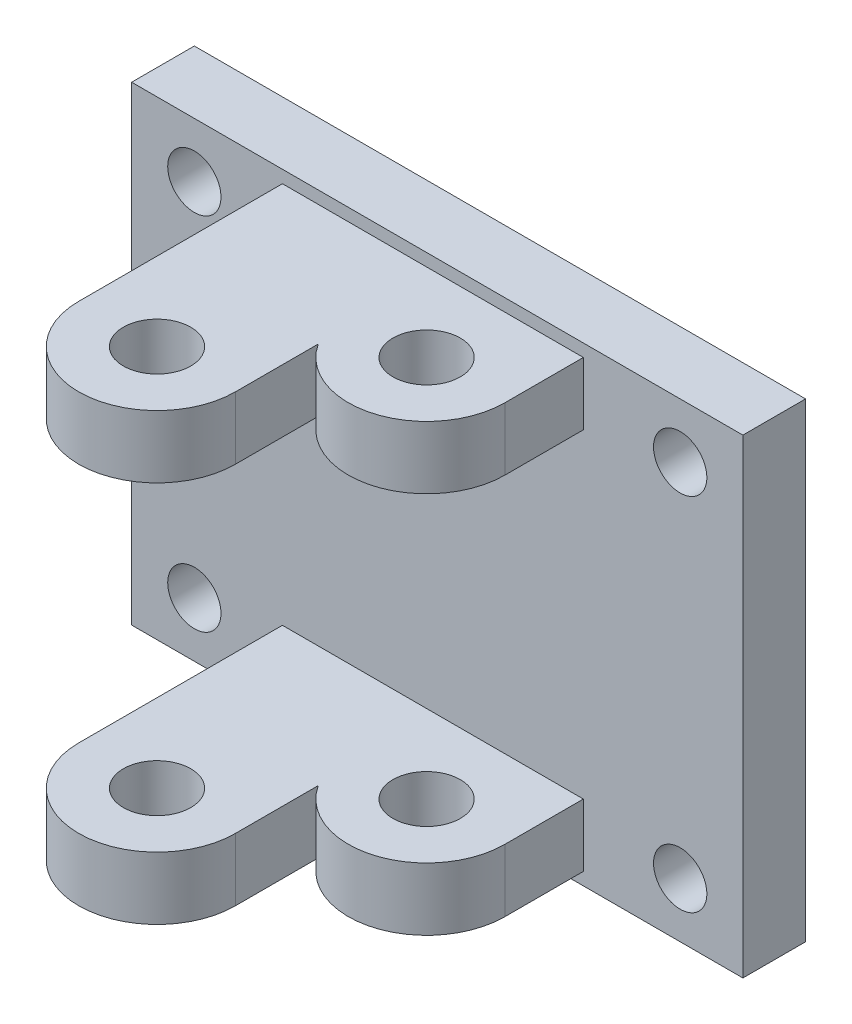
ISO-10303-21;
HEADER;
FILE_DESCRIPTION(('STEP AP214'),'2;1');
FILE_NAME('part.step','',(''),(''),'','','');
FILE_SCHEMA(('AUTOMOTIVE_DESIGN { 1 0 10303 214 1 1 1 1 }'));
ENDSEC;
DATA;
#1=APPLICATION_CONTEXT('core data for automotive mechanical design processes');
#2=APPLICATION_PROTOCOL_DEFINITION('international standard','automotive_design',2000,#1);
#3=PRODUCT_CONTEXT('',#1,'mechanical');
#4=PRODUCT('Part','Part','',(#3));
#5=PRODUCT_RELATED_PRODUCT_CATEGORY('part','',(#4));
#6=PRODUCT_DEFINITION_FORMATION('','',#4);
#7=PRODUCT_DEFINITION_CONTEXT('part definition',#1,'design');
#8=PRODUCT_DEFINITION('design','',#6,#7);
#9=PRODUCT_DEFINITION_SHAPE('','',#8);
#10=(LENGTH_UNIT() NAMED_UNIT(*) SI_UNIT(.MILLI.,.METRE.));
#11=(NAMED_UNIT(*) PLANE_ANGLE_UNIT() SI_UNIT($,.RADIAN.));
#12=(NAMED_UNIT(*) SI_UNIT($,.STERADIAN.) SOLID_ANGLE_UNIT());
#13=UNCERTAINTY_MEASURE_WITH_UNIT(LENGTH_MEASURE(1.E-05),#10,'distance_accuracy_value','');
#14=(GEOMETRIC_REPRESENTATION_CONTEXT(3) GLOBAL_UNCERTAINTY_ASSIGNED_CONTEXT((#13)) GLOBAL_UNIT_ASSIGNED_CONTEXT((#10,
#11,#12)) REPRESENTATION_CONTEXT('',''));
#15=CARTESIAN_POINT('',(0.,0.,0.));
#16=DIRECTION('',(0.,0.,1.));
#17=DIRECTION('',(1.,0.,0.));
#18=AXIS2_PLACEMENT_3D('',#15,#16,#17);
#19=CARTESIAN_POINT('',(42.620525892443,-10.2,21.));
#20=DIRECTION('',(-1.,0.,0.));
#21=DIRECTION('',(0.,0.,1.));
#22=AXIS2_PLACEMENT_3D('',#19,#20,#21);
#23=PLANE('',#22);
#24=DIRECTION('',(0.,-1.,0.));
#25=VECTOR('',#24,1.);
#26=CARTESIAN_POINT('',(42.620525892443,-10.2,15.7129319932486));
#27=LINE('',#26,#25);
#28=CARTESIAN_POINT('',(42.620525892443,-10.2,15.7129319932486));
#29=VERTEX_POINT('',#28);
#30=CARTESIAN_POINT('',(42.620525892443,-14.2,15.7129319932486));
#31=VERTEX_POINT('',#30);
#32=EDGE_CURVE('E161',#29,#31,#27,.T.);
#33=ORIENTED_EDGE('',*,*,#32,.F.);
#34=DIRECTION('',(0.,0.,-1.));
#35=VECTOR('',#34,1.);
#36=CARTESIAN_POINT('',(42.620525892443,-10.2,21.));
#37=LINE('',#36,#35);
#38=CARTESIAN_POINT('',(42.620525892443,-10.2,21.));
#39=VERTEX_POINT('',#38);
#40=EDGE_CURVE('E391',#39,#29,#37,.T.);
#41=ORIENTED_EDGE('',*,*,#40,.F.);
#42=DIRECTION('',(0.,-1.,0.));
#43=VECTOR('',#42,1.);
#44=CARTESIAN_POINT('',(42.620525892443,-10.2,21.));
#45=LINE('',#44,#43);
#46=CARTESIAN_POINT('',(42.620525892443,-14.2,21.));
#47=VERTEX_POINT('',#46);
#48=EDGE_CURVE('E184',#39,#47,#45,.T.);
#49=ORIENTED_EDGE('',*,*,#48,.T.);
#50=DIRECTION('',(0.,0.,-1.));
#51=VECTOR('',#50,1.);
#52=CARTESIAN_POINT('',(42.620525892443,-14.2,21.));
#53=LINE('',#52,#51);
#54=EDGE_CURVE('E180',#47,#31,#53,.T.);
#55=ORIENTED_EDGE('',*,*,#54,.T.);
#56=EDGE_LOOP('',(#33,#41,#49,#55));
#57=FACE_BOUND('',#56,.T.);
#58=ADVANCED_FACE('F44',(#57),#23,.F.);
#59=CARTESIAN_POINT('',(0.,0.,8.));
#60=DIRECTION('',(0.,0.,-1.));
#61=DIRECTION('',(-1.,0.,0.));
#62=AXIS2_PLACEMENT_3D('',#59,#60,#61);
#63=PLANE('',#62);
#64=CARTESIAN_POINT('',(27.,11.5,8.));
#65=DIRECTION('',(0.,0.,-1.));
#66=DIRECTION('',(-1.,0.,0.));
#67=AXIS2_PLACEMENT_3D('',#64,#65,#66);
#68=CIRCLE('',#67,1.7);
#69=CARTESIAN_POINT('',(25.3,11.5,8.));
#70=VERTEX_POINT('',#69);
#71=EDGE_CURVE('E314',#70,#70,#68,.F.);
#72=ORIENTED_EDGE('',*,*,#71,.F.);
#73=EDGE_LOOP('',(#72));
#74=FACE_BOUND('',#73,.T.);
#75=CARTESIAN_POINT('',(58.,-11.5,8.));
#76=DIRECTION('',(0.,0.,-1.));
#77=DIRECTION('',(-1.,0.,0.));
#78=AXIS2_PLACEMENT_3D('',#75,#76,#77);
#79=CIRCLE('',#78,1.7);
#80=CARTESIAN_POINT('',(56.3,-11.5,8.));
#81=VERTEX_POINT('',#80);
#82=EDGE_CURVE('E334',#81,#81,#79,.F.);
#83=ORIENTED_EDGE('',*,*,#82,.F.);
#84=EDGE_LOOP('',(#83));
#85=FACE_BOUND('',#84,.T.);
#86=CARTESIAN_POINT('',(58.,11.5,8.));
#87=DIRECTION('',(0.,0.,-1.));
#88=DIRECTION('',(-1.,0.,0.));
#89=AXIS2_PLACEMENT_3D('',#86,#87,#88);
#90=CIRCLE('',#89,1.7);
#91=CARTESIAN_POINT('',(56.3,11.5,8.));
#92=VERTEX_POINT('',#91);
#93=EDGE_CURVE('E328',#92,#92,#90,.F.);
#94=ORIENTED_EDGE('',*,*,#93,.F.);
#95=EDGE_LOOP('',(#94));
#96=FACE_BOUND('',#95,.T.);
#97=CARTESIAN_POINT('',(27.,-11.5,8.));
#98=DIRECTION('',(0.,0.,-1.));
#99=DIRECTION('',(-1.,0.,0.));
#100=AXIS2_PLACEMENT_3D('',#97,#98,#99);
#101=CIRCLE('',#100,1.7);
#102=CARTESIAN_POINT('',(25.3,-11.5,8.));
#103=VERTEX_POINT('',#102);
#104=EDGE_CURVE('E324',#103,#103,#101,.F.);
#105=ORIENTED_EDGE('',*,*,#104,.F.);
#106=EDGE_LOOP('',(#105));
#107=FACE_BOUND('',#106,.T.);
#108=DIRECTION('',(0.,-1.,0.));
#109=VECTOR('',#108,1.);
#110=CARTESIAN_POINT('',(51.820525892444,-10.2,8.));
#111=LINE('',#110,#109);
#112=CARTESIAN_POINT('',(51.820525892444,-10.2,8.));
#113=VERTEX_POINT('',#112);
#114=CARTESIAN_POINT('',(51.820525892444,-14.2,8.));
#115=VERTEX_POINT('',#114);
#116=EDGE_CURVE('E372',#113,#115,#111,.T.);
#117=ORIENTED_EDGE('',*,*,#116,.T.);
#118=DIRECTION('',(-1.,0.,0.));
#119=VECTOR('',#118,1.);
#120=CARTESIAN_POINT('',(32.620525892443,-14.2,8.));
#121=LINE('',#120,#119);
#122=CARTESIAN_POINT('',(32.620525892443,-14.2,8.));
#123=VERTEX_POINT('',#122);
#124=EDGE_CURVE('E72',#115,#123,#121,.T.);
#125=ORIENTED_EDGE('',*,*,#124,.T.);
#126=DIRECTION('',(0.,-1.,0.));
#127=VECTOR('',#126,1.);
#128=CARTESIAN_POINT('',(32.620525892443,-10.2,8.));
#129=LINE('',#128,#127);
#130=CARTESIAN_POINT('',(32.620525892443,-10.2,8.));
#131=VERTEX_POINT('',#130);
#132=EDGE_CURVE('E197',#131,#123,#129,.T.);
#133=ORIENTED_EDGE('',*,*,#132,.F.);
#134=DIRECTION('',(-1.,0.,0.));
#135=VECTOR('',#134,1.);
#136=CARTESIAN_POINT('',(32.620525892443,-10.2,8.));
#137=LINE('',#136,#135);
#138=EDGE_CURVE('E62',#113,#131,#137,.T.);
#139=ORIENTED_EDGE('',*,*,#138,.F.);
#140=EDGE_LOOP('',(#117,#125,#133,#139));
#141=FACE_BOUND('',#140,.T.);
#142=DIRECTION('',(0.,-1.,0.));
#143=VECTOR('',#142,1.);
#144=CARTESIAN_POINT('',(23.,-15.,8.));
#145=LINE('',#144,#143);
#146=CARTESIAN_POINT('',(23.,15.,8.));
#147=VERTEX_POINT('',#146);
#148=CARTESIAN_POINT('',(23.,-15.,8.));
#149=VERTEX_POINT('',#148);
#150=EDGE_CURVE('E272',#147,#149,#145,.T.);
#151=ORIENTED_EDGE('',*,*,#150,.T.);
#152=DIRECTION('',(1.,0.,0.));
#153=VECTOR('',#152,1.);
#154=CARTESIAN_POINT('',(23.,-15.,8.));
#155=LINE('',#154,#153);
#156=CARTESIAN_POINT('',(62.,-15.,8.));
#157=VERTEX_POINT('',#156);
#158=EDGE_CURVE('E280',#149,#157,#155,.T.);
#159=ORIENTED_EDGE('',*,*,#158,.T.);
#160=DIRECTION('',(0.,1.,0.));
#161=VECTOR('',#160,1.);
#162=CARTESIAN_POINT('',(62.,-15.,8.));
#163=LINE('',#162,#161);
#164=CARTESIAN_POINT('',(62.,15.,8.));
#165=VERTEX_POINT('',#164);
#166=EDGE_CURVE('E281',#157,#165,#163,.T.);
#167=ORIENTED_EDGE('',*,*,#166,.T.);
#168=DIRECTION('',(-1.,0.,0.));
#169=VECTOR('',#168,1.);
#170=CARTESIAN_POINT('',(23.,15.,8.));
#171=LINE('',#170,#169);
#172=EDGE_CURVE('E283',#165,#147,#171,.T.);
#173=ORIENTED_EDGE('',*,*,#172,.T.);
#174=EDGE_LOOP('',(#151,#159,#167,#173));
#175=FACE_BOUND('',#174,.T.);
#176=DIRECTION('',(0.,-1.,0.));
#177=VECTOR('',#176,1.);
#178=CARTESIAN_POINT('',(51.820525892444,14.2,8.));
#179=LINE('',#178,#177);
#180=CARTESIAN_POINT('',(51.820525892444,14.2,8.));
#181=VERTEX_POINT('',#180);
#182=CARTESIAN_POINT('',(51.820525892444,10.2,8.));
#183=VERTEX_POINT('',#182);
#184=EDGE_CURVE('E222',#181,#183,#179,.T.);
#185=ORIENTED_EDGE('',*,*,#184,.T.);
#186=DIRECTION('',(-1.,0.,0.));
#187=VECTOR('',#186,1.);
#188=CARTESIAN_POINT('',(32.620525892443,10.2,8.));
#189=LINE('',#188,#187);
#190=CARTESIAN_POINT('',(32.620525892443,10.2,8.));
#191=VERTEX_POINT('',#190);
#192=EDGE_CURVE('E244',#183,#191,#189,.T.);
#193=ORIENTED_EDGE('',*,*,#192,.T.);
#194=DIRECTION('',(0.,-1.,0.));
#195=VECTOR('',#194,1.);
#196=CARTESIAN_POINT('',(32.620525892443,14.2,8.));
#197=LINE('',#196,#195);
#198=CARTESIAN_POINT('',(32.620525892443,14.2,8.));
#199=VERTEX_POINT('',#198);
#200=EDGE_CURVE('E252',#199,#191,#197,.T.);
#201=ORIENTED_EDGE('',*,*,#200,.F.);
#202=DIRECTION('',(-1.,0.,0.));
#203=VECTOR('',#202,1.);
#204=CARTESIAN_POINT('',(32.620525892443,14.2,8.));
#205=LINE('',#204,#203);
#206=EDGE_CURVE('E246',#181,#199,#205,.T.);
#207=ORIENTED_EDGE('',*,*,#206,.F.);
#208=EDGE_LOOP('',(#185,#193,#201,#207));
#209=FACE_BOUND('',#208,.T.);
#210=ADVANCED_FACE('F405',(#74,#85,#96,#107,#141,#175,#209),#63,.F.);
#211=CARTESIAN_POINT('',(42.620525892443,14.2,21.));
#212=DIRECTION('',(-1.,0.,0.));
#213=DIRECTION('',(0.,0.,1.));
#214=AXIS2_PLACEMENT_3D('',#211,#212,#213);
#215=PLANE('',#214);
#216=DIRECTION('',(0.,-1.,0.));
#217=VECTOR('',#216,1.);
#218=CARTESIAN_POINT('',(42.620525892443,14.2,15.7129319932486));
#219=LINE('',#218,#217);
#220=CARTESIAN_POINT('',(42.620525892443,14.2,15.7129319932486));
#221=VERTEX_POINT('',#220);
#222=CARTESIAN_POINT('',(42.620525892443,10.2,15.7129319932486));
#223=VERTEX_POINT('',#222);
#224=EDGE_CURVE('E211',#221,#223,#219,.T.);
#225=ORIENTED_EDGE('',*,*,#224,.F.);
#226=DIRECTION('',(0.,0.,-1.));
#227=VECTOR('',#226,1.);
#228=CARTESIAN_POINT('',(42.620525892443,14.2,21.));
#229=LINE('',#228,#227);
#230=CARTESIAN_POINT('',(42.620525892443,14.2,21.));
#231=VERTEX_POINT('',#230);
#232=EDGE_CURVE('E243',#231,#221,#229,.T.);
#233=ORIENTED_EDGE('',*,*,#232,.F.);
#234=DIRECTION('',(0.,-1.,0.));
#235=VECTOR('',#234,1.);
#236=CARTESIAN_POINT('',(42.620525892443,14.2,21.));
#237=LINE('',#236,#235);
#238=CARTESIAN_POINT('',(42.620525892443,10.2,21.));
#239=VERTEX_POINT('',#238);
#240=EDGE_CURVE('E264',#231,#239,#237,.T.);
#241=ORIENTED_EDGE('',*,*,#240,.T.);
#242=DIRECTION('',(0.,0.,-1.));
#243=VECTOR('',#242,1.);
#244=CARTESIAN_POINT('',(42.620525892443,10.2,21.));
#245=LINE('',#244,#243);
#246=EDGE_CURVE('E258',#239,#223,#245,.T.);
#247=ORIENTED_EDGE('',*,*,#246,.T.);
#248=EDGE_LOOP('',(#225,#233,#241,#247));
#249=FACE_BOUND('',#248,.T.);
#250=ADVANCED_FACE('F425',(#249),#215,.F.);
#251=CARTESIAN_POINT('',(23.,-15.,8.));
#252=DIRECTION('',(1.,0.,0.));
#253=DIRECTION('',(0.,0.,-1.));
#254=AXIS2_PLACEMENT_3D('',#251,#252,#253);
#255=PLANE('',#254);
#256=DIRECTION('',(0.,-1.,0.));
#257=VECTOR('',#256,1.);
#258=CARTESIAN_POINT('',(23.,-15.,4.));
#259=LINE('',#258,#257);
#260=CARTESIAN_POINT('',(23.,15.,4.));
#261=VERTEX_POINT('',#260);
#262=CARTESIAN_POINT('',(23.,-15.,4.));
#263=VERTEX_POINT('',#262);
#264=EDGE_CURVE('E275',#261,#263,#259,.T.);
#265=ORIENTED_EDGE('',*,*,#264,.T.);
#266=DIRECTION('',(0.,0.,-1.));
#267=VECTOR('',#266,1.);
#268=CARTESIAN_POINT('',(23.,-15.,8.));
#269=LINE('',#268,#267);
#270=EDGE_CURVE('E11',#149,#263,#269,.T.);
#271=ORIENTED_EDGE('',*,*,#270,.F.);
#272=ORIENTED_EDGE('',*,*,#150,.F.);
#273=DIRECTION('',(0.,0.,-1.));
#274=VECTOR('',#273,1.);
#275=CARTESIAN_POINT('',(23.,15.,8.));
#276=LINE('',#275,#274);
#277=EDGE_CURVE('E289',#147,#261,#276,.T.);
#278=ORIENTED_EDGE('',*,*,#277,.T.);
#279=EDGE_LOOP('',(#265,#271,#272,#278));
#280=FACE_BOUND('',#279,.T.);
#281=ADVANCED_FACE('F50',(#280),#255,.F.);
#282=CARTESIAN_POINT('',(23.,-15.,8.));
#283=DIRECTION('',(0.,1.,0.));
#284=DIRECTION('',(0.,0.,1.));
#285=AXIS2_PLACEMENT_3D('',#282,#283,#284);
#286=PLANE('',#285);
#287=DIRECTION('',(1.,0.,0.));
#288=VECTOR('',#287,1.);
#289=CARTESIAN_POINT('',(23.,-15.,4.));
#290=LINE('',#289,#288);
#291=CARTESIAN_POINT('',(62.,-15.,4.));
#292=VERTEX_POINT('',#291);
#293=EDGE_CURVE('E292',#263,#292,#290,.T.);
#294=ORIENTED_EDGE('',*,*,#293,.T.);
#295=DIRECTION('',(0.,0.,-1.));
#296=VECTOR('',#295,1.);
#297=CARTESIAN_POINT('',(62.,-15.,8.));
#298=LINE('',#297,#296);
#299=EDGE_CURVE('E54',#157,#292,#298,.T.);
#300=ORIENTED_EDGE('',*,*,#299,.F.);
#301=ORIENTED_EDGE('',*,*,#158,.F.);
#302=ORIENTED_EDGE('',*,*,#270,.T.);
#303=EDGE_LOOP('',(#294,#300,#301,#302));
#304=FACE_BOUND('',#303,.T.);
#305=ADVANCED_FACE('F469',(#304),#286,.F.);
#306=CARTESIAN_POINT('',(62.,-15.,8.));
#307=DIRECTION('',(-1.,0.,0.));
#308=DIRECTION('',(0.,0.,1.));
#309=AXIS2_PLACEMENT_3D('',#306,#307,#308);
#310=PLANE('',#309);
#311=DIRECTION('',(0.,1.,0.));
#312=VECTOR('',#311,1.);
#313=CARTESIAN_POINT('',(62.,-15.,4.));
#314=LINE('',#313,#312);
#315=CARTESIAN_POINT('',(62.,15.,4.));
#316=VERTEX_POINT('',#315);
#317=EDGE_CURVE('E294',#292,#316,#314,.T.);
#318=ORIENTED_EDGE('',*,*,#317,.T.);
#319=DIRECTION('',(0.,0.,-1.));
#320=VECTOR('',#319,1.);
#321=CARTESIAN_POINT('',(62.,15.,8.));
#322=LINE('',#321,#320);
#323=EDGE_CURVE('E304',#165,#316,#322,.T.);
#324=ORIENTED_EDGE('',*,*,#323,.F.);
#325=ORIENTED_EDGE('',*,*,#166,.F.);
#326=ORIENTED_EDGE('',*,*,#299,.T.);
#327=EDGE_LOOP('',(#318,#324,#325,#326));
#328=FACE_BOUND('',#327,.T.);
#329=ADVANCED_FACE('F463',(#328),#310,.F.);
#330=CARTESIAN_POINT('',(23.,15.,8.));
#331=DIRECTION('',(0.,-1.,0.));
#332=DIRECTION('',(0.,0.,-1.));
#333=AXIS2_PLACEMENT_3D('',#330,#331,#332);
#334=PLANE('',#333);
#335=DIRECTION('',(-1.,0.,0.));
#336=VECTOR('',#335,1.);
#337=CARTESIAN_POINT('',(23.,15.,4.));
#338=LINE('',#337,#336);
#339=EDGE_CURVE('E279',#316,#261,#338,.T.);
#340=ORIENTED_EDGE('',*,*,#339,.T.);
#341=ORIENTED_EDGE('',*,*,#277,.F.);
#342=ORIENTED_EDGE('',*,*,#172,.F.);
#343=ORIENTED_EDGE('',*,*,#323,.T.);
#344=EDGE_LOOP('',(#340,#341,#342,#343));
#345=FACE_BOUND('',#344,.T.);
#346=ADVANCED_FACE('F458',(#345),#334,.F.);
#347=CARTESIAN_POINT('',(0.,0.,4.));
#348=DIRECTION('',(0.,0.,-1.));
#349=DIRECTION('',(-1.,0.,0.));
#350=AXIS2_PLACEMENT_3D('',#347,#348,#349);
#351=PLANE('',#350);
#352=CARTESIAN_POINT('',(27.,11.5,4.));
#353=DIRECTION('',(0.,0.,-1.));
#354=DIRECTION('',(-1.,0.,0.));
#355=AXIS2_PLACEMENT_3D('',#352,#353,#354);
#356=CIRCLE('',#355,1.7);
#357=CARTESIAN_POINT('',(25.3,11.5,4.));
#358=VERTEX_POINT('',#357);
#359=EDGE_CURVE('E47',#358,#358,#356,.F.);
#360=ORIENTED_EDGE('',*,*,#359,.T.);
#361=EDGE_LOOP('',(#360));
#362=FACE_BOUND('',#361,.T.);
#363=CARTESIAN_POINT('',(58.,-11.5,4.));
#364=DIRECTION('',(0.,0.,-1.));
#365=DIRECTION('',(-1.,0.,0.));
#366=AXIS2_PLACEMENT_3D('',#363,#364,#365);
#367=CIRCLE('',#366,1.7);
#368=CARTESIAN_POINT('',(56.3,-11.5,4.));
#369=VERTEX_POINT('',#368);
#370=EDGE_CURVE('E329',#369,#369,#367,.F.);
#371=ORIENTED_EDGE('',*,*,#370,.T.);
#372=EDGE_LOOP('',(#371));
#373=FACE_BOUND('',#372,.T.);
#374=CARTESIAN_POINT('',(58.,11.5,4.));
#375=DIRECTION('',(0.,0.,-1.));
#376=DIRECTION('',(-1.,0.,0.));
#377=AXIS2_PLACEMENT_3D('',#374,#375,#376);
#378=CIRCLE('',#377,1.7);
#379=CARTESIAN_POINT('',(56.3,11.5,4.));
#380=VERTEX_POINT('',#379);
#381=EDGE_CURVE('E326',#380,#380,#378,.F.);
#382=ORIENTED_EDGE('',*,*,#381,.T.);
#383=EDGE_LOOP('',(#382));
#384=FACE_BOUND('',#383,.T.);
#385=CARTESIAN_POINT('',(27.,-11.5,4.));
#386=DIRECTION('',(0.,0.,-1.));
#387=DIRECTION('',(-1.,0.,0.));
#388=AXIS2_PLACEMENT_3D('',#385,#386,#387);
#389=CIRCLE('',#388,1.7);
#390=CARTESIAN_POINT('',(25.3,-11.5,4.));
#391=VERTEX_POINT('',#390);
#392=EDGE_CURVE('E321',#391,#391,#389,.F.);
#393=ORIENTED_EDGE('',*,*,#392,.T.);
#394=EDGE_LOOP('',(#393));
#395=FACE_BOUND('',#394,.T.);
#396=ORIENTED_EDGE('',*,*,#264,.F.);
#397=ORIENTED_EDGE('',*,*,#339,.F.);
#398=ORIENTED_EDGE('',*,*,#317,.F.);
#399=ORIENTED_EDGE('',*,*,#293,.F.);
#400=EDGE_LOOP('',(#396,#397,#398,#399));
#401=FACE_BOUND('',#400,.T.);
#402=ADVANCED_FACE('F453',(#362,#373,#384,#395,#401),#351,.T.);
#403=CARTESIAN_POINT('',(32.620525892443,14.2,21.));
#404=DIRECTION('',(1.,0.,0.));
#405=DIRECTION('',(0.,0.,-1.));
#406=AXIS2_PLACEMENT_3D('',#403,#404,#405);
#407=PLANE('',#406);
#408=DIRECTION('',(0.,0.,1.));
#409=VECTOR('',#408,1.);
#410=CARTESIAN_POINT('',(32.620525892443,10.2,21.));
#411=LINE('',#410,#409);
#412=CARTESIAN_POINT('',(32.620525892443,10.2,21.));
#413=VERTEX_POINT('',#412);
#414=EDGE_CURVE('E240',#191,#413,#411,.T.);
#415=ORIENTED_EDGE('',*,*,#414,.T.);
#416=DIRECTION('',(0.,-1.,0.));
#417=VECTOR('',#416,1.);
#418=CARTESIAN_POINT('',(32.620525892443,14.2,21.));
#419=LINE('',#418,#417);
#420=CARTESIAN_POINT('',(32.620525892443,14.2,21.));
#421=VERTEX_POINT('',#420);
#422=EDGE_CURVE('E267',#421,#413,#419,.T.);
#423=ORIENTED_EDGE('',*,*,#422,.F.);
#424=DIRECTION('',(0.,0.,1.));
#425=VECTOR('',#424,1.);
#426=CARTESIAN_POINT('',(32.620525892443,14.2,21.));
#427=LINE('',#426,#425);
#428=EDGE_CURVE('E238',#199,#421,#427,.T.);
#429=ORIENTED_EDGE('',*,*,#428,.F.);
#430=ORIENTED_EDGE('',*,*,#200,.T.);
#431=EDGE_LOOP('',(#415,#423,#429,#430));
#432=FACE_BOUND('',#431,.T.);
#433=ADVANCED_FACE('F446',(#432),#407,.F.);
#434=CARTESIAN_POINT('',(0.,14.2,0.));
#435=DIRECTION('',(0.,-1.,0.));
#436=DIRECTION('',(0.,0.,-1.));
#437=AXIS2_PLACEMENT_3D('',#434,#435,#436);
#438=PLANE('',#437);
#439=CARTESIAN_POINT('',(37.620525892443,14.2,21.));
#440=DIRECTION('',(0.,-1.,0.));
#441=DIRECTION('',(0.,0.,-1.));
#442=AXIS2_PLACEMENT_3D('',#439,#440,#441);
#443=CIRCLE('',#442,2.15);
#444=CARTESIAN_POINT('',(37.620525892443,14.2,18.85));
#445=VERTEX_POINT('',#444);
#446=EDGE_CURVE('E182',#445,#445,#443,.F.);
#447=ORIENTED_EDGE('',*,*,#446,.F.);
#448=EDGE_LOOP('',(#447));
#449=FACE_BOUND('',#448,.T.);
#450=CARTESIAN_POINT('',(46.820525892444,14.2,13.));
#451=DIRECTION('',(0.,-1.,0.));
#452=DIRECTION('',(0.,0.,-1.));
#453=AXIS2_PLACEMENT_3D('',#450,#451,#452);
#454=CIRCLE('',#453,2.15);
#455=CARTESIAN_POINT('',(46.820525892444,14.2,10.85));
#456=VERTEX_POINT('',#455);
#457=EDGE_CURVE('E319',#456,#456,#454,.F.);
#458=ORIENTED_EDGE('',*,*,#457,.F.);
#459=EDGE_LOOP('',(#458));
#460=FACE_BOUND('',#459,.T.);
#461=ORIENTED_EDGE('',*,*,#232,.T.);
#462=CARTESIAN_POINT('',(46.820525892444,14.2,13.));
#463=DIRECTION('',(0.,1.,0.));
#464=DIRECTION('',(0.,0.,1.));
#465=AXIS2_PLACEMENT_3D('',#462,#463,#464);
#466=CIRCLE('',#465,5.);
#467=CARTESIAN_POINT('',(51.820525892444,14.2,13.));
#468=VERTEX_POINT('',#467);
#469=EDGE_CURVE('E210',#221,#468,#466,.T.);
#470=ORIENTED_EDGE('',*,*,#469,.T.);
#471=DIRECTION('',(0.,0.,-1.));
#472=VECTOR('',#471,1.);
#473=CARTESIAN_POINT('',(51.820525892444,14.2,13.));
#474=LINE('',#473,#472);
#475=EDGE_CURVE('E220',#468,#181,#474,.T.);
#476=ORIENTED_EDGE('',*,*,#475,.T.);
#477=ORIENTED_EDGE('',*,*,#206,.T.);
#478=ORIENTED_EDGE('',*,*,#428,.T.);
#479=CARTESIAN_POINT('',(37.620525892443,14.2,21.));
#480=DIRECTION('',(0.,1.,0.));
#481=DIRECTION('',(0.,0.,1.));
#482=AXIS2_PLACEMENT_3D('',#479,#480,#481);
#483=CIRCLE('',#482,5.);
#484=EDGE_CURVE('E235',#421,#231,#483,.T.);
#485=ORIENTED_EDGE('',*,*,#484,.T.);
#486=EDGE_LOOP('',(#461,#470,#476,#477,#478,#485));
#487=FACE_BOUND('',#486,.T.);
#488=ADVANCED_FACE('F444',(#449,#460,#487),#438,.F.);
#489=CARTESIAN_POINT('',(0.,10.2,0.));
#490=DIRECTION('',(0.,-1.,0.));
#491=DIRECTION('',(0.,0.,-1.));
#492=AXIS2_PLACEMENT_3D('',#489,#490,#491);
#493=PLANE('',#492);
#494=CARTESIAN_POINT('',(37.620525892443,10.2,21.));
#495=DIRECTION('',(0.,-1.,0.));
#496=DIRECTION('',(0.,0.,-1.));
#497=AXIS2_PLACEMENT_3D('',#494,#495,#496);
#498=CIRCLE('',#497,2.15);
#499=CARTESIAN_POINT('',(37.620525892443,10.2,18.85));
#500=VERTEX_POINT('',#499);
#501=EDGE_CURVE('E362',#500,#500,#498,.F.);
#502=ORIENTED_EDGE('',*,*,#501,.T.);
#503=EDGE_LOOP('',(#502));
#504=FACE_BOUND('',#503,.T.);
#505=CARTESIAN_POINT('',(46.820525892444,10.2,13.));
#506=DIRECTION('',(0.,-1.,0.));
#507=DIRECTION('',(0.,0.,-1.));
#508=AXIS2_PLACEMENT_3D('',#505,#506,#507);
#509=CIRCLE('',#508,2.15);
#510=CARTESIAN_POINT('',(46.820525892444,10.2,10.85));
#511=VERTEX_POINT('',#510);
#512=EDGE_CURVE('E355',#511,#511,#509,.F.);
#513=ORIENTED_EDGE('',*,*,#512,.T.);
#514=EDGE_LOOP('',(#513));
#515=FACE_BOUND('',#514,.T.);
#516=DIRECTION('',(0.,0.,-1.));
#517=VECTOR('',#516,1.);
#518=CARTESIAN_POINT('',(51.820525892444,10.2,13.));
#519=LINE('',#518,#517);
#520=CARTESIAN_POINT('',(51.820525892444,10.2,13.));
#521=VERTEX_POINT('',#520);
#522=EDGE_CURVE('E216',#521,#183,#519,.T.);
#523=ORIENTED_EDGE('',*,*,#522,.F.);
#524=CARTESIAN_POINT('',(46.820525892444,10.2,13.));
#525=DIRECTION('',(0.,1.,0.));
#526=DIRECTION('',(0.,0.,1.));
#527=AXIS2_PLACEMENT_3D('',#524,#525,#526);
#528=CIRCLE('',#527,5.);
#529=EDGE_CURVE('E206',#223,#521,#528,.T.);
#530=ORIENTED_EDGE('',*,*,#529,.F.);
#531=ORIENTED_EDGE('',*,*,#246,.F.);
#532=CARTESIAN_POINT('',(37.620525892443,10.2,21.));
#533=DIRECTION('',(0.,1.,0.));
#534=DIRECTION('',(0.,0.,1.));
#535=AXIS2_PLACEMENT_3D('',#532,#533,#534);
#536=CIRCLE('',#535,5.);
#537=EDGE_CURVE('E234',#413,#239,#536,.T.);
#538=ORIENTED_EDGE('',*,*,#537,.F.);
#539=ORIENTED_EDGE('',*,*,#414,.F.);
#540=ORIENTED_EDGE('',*,*,#192,.F.);
#541=EDGE_LOOP('',(#523,#530,#531,#538,#539,#540));
#542=FACE_BOUND('',#541,.T.);
#543=ADVANCED_FACE('F442',(#504,#515,#542),#493,.T.);
#544=CARTESIAN_POINT('',(37.620525892443,14.2,21.));
#545=DIRECTION('',(0.,-1.,0.));
#546=DIRECTION('',(0.,0.,-1.));
#547=AXIS2_PLACEMENT_3D('',#544,#545,#546);
#548=CYLINDRICAL_SURFACE('',#547,5.);
#549=ORIENTED_EDGE('',*,*,#484,.F.);
#550=ORIENTED_EDGE('',*,*,#422,.T.);
#551=ORIENTED_EDGE('',*,*,#537,.T.);
#552=ORIENTED_EDGE('',*,*,#240,.F.);
#553=EDGE_LOOP('',(#549,#550,#551,#552));
#554=FACE_BOUND('',#553,.T.);
#555=ADVANCED_FACE('F440',(#554),#548,.T.);
#556=CARTESIAN_POINT('',(51.820525892444,14.2,13.));
#557=DIRECTION('',(-1.,0.,0.));
#558=DIRECTION('',(0.,0.,1.));
#559=AXIS2_PLACEMENT_3D('',#556,#557,#558);
#560=PLANE('',#559);
#561=ORIENTED_EDGE('',*,*,#522,.T.);
#562=ORIENTED_EDGE('',*,*,#184,.F.);
#563=ORIENTED_EDGE('',*,*,#475,.F.);
#564=DIRECTION('',(0.,-1.,0.));
#565=VECTOR('',#564,1.);
#566=CARTESIAN_POINT('',(51.820525892444,14.2,13.));
#567=LINE('',#566,#565);
#568=EDGE_CURVE('E227',#468,#521,#567,.T.);
#569=ORIENTED_EDGE('',*,*,#568,.T.);
#570=EDGE_LOOP('',(#561,#562,#563,#569));
#571=FACE_BOUND('',#570,.T.);
#572=ADVANCED_FACE('F433',(#571),#560,.F.);
#573=CARTESIAN_POINT('',(46.820525892444,14.2,13.));
#574=DIRECTION('',(0.,-1.,0.));
#575=DIRECTION('',(0.,0.,-1.));
#576=AXIS2_PLACEMENT_3D('',#573,#574,#575);
#577=CYLINDRICAL_SURFACE('',#576,5.);
#578=ORIENTED_EDGE('',*,*,#469,.F.);
#579=ORIENTED_EDGE('',*,*,#224,.T.);
#580=ORIENTED_EDGE('',*,*,#529,.T.);
#581=ORIENTED_EDGE('',*,*,#568,.F.);
#582=EDGE_LOOP('',(#578,#579,#580,#581));
#583=FACE_BOUND('',#582,.T.);
#584=ADVANCED_FACE('F429',(#583),#577,.T.);
#585=CARTESIAN_POINT('',(32.620525892443,-10.2,21.));
#586=DIRECTION('',(1.,0.,0.));
#587=DIRECTION('',(0.,0.,-1.));
#588=AXIS2_PLACEMENT_3D('',#585,#586,#587);
#589=PLANE('',#588);
#590=DIRECTION('',(0.,0.,1.));
#591=VECTOR('',#590,1.);
#592=CARTESIAN_POINT('',(32.620525892443,-14.2,21.));
#593=LINE('',#592,#591);
#594=CARTESIAN_POINT('',(32.620525892443,-14.2,21.));
#595=VERTEX_POINT('',#594);
#596=EDGE_CURVE('E186',#123,#595,#593,.T.);
#597=ORIENTED_EDGE('',*,*,#596,.T.);
#598=DIRECTION('',(0.,-1.,0.));
#599=VECTOR('',#598,1.);
#600=CARTESIAN_POINT('',(32.620525892443,-10.2,21.));
#601=LINE('',#600,#599);
#602=CARTESIAN_POINT('',(32.620525892443,-10.2,21.));
#603=VERTEX_POINT('',#602);
#604=EDGE_CURVE('E201',#603,#595,#601,.T.);
#605=ORIENTED_EDGE('',*,*,#604,.F.);
#606=DIRECTION('',(0.,0.,1.));
#607=VECTOR('',#606,1.);
#608=CARTESIAN_POINT('',(32.620525892443,-10.2,21.));
#609=LINE('',#608,#607);
#610=EDGE_CURVE('E189',#131,#603,#609,.T.);
#611=ORIENTED_EDGE('',*,*,#610,.F.);
#612=ORIENTED_EDGE('',*,*,#132,.T.);
#613=EDGE_LOOP('',(#597,#605,#611,#612));
#614=FACE_BOUND('',#613,.T.);
#615=ADVANCED_FACE('F402',(#614),#589,.F.);
#616=CARTESIAN_POINT('',(0.,-10.2,0.));
#617=DIRECTION('',(0.,-1.,0.));
#618=DIRECTION('',(0.,0.,-1.));
#619=AXIS2_PLACEMENT_3D('',#616,#617,#618);
#620=PLANE('',#619);
#621=CARTESIAN_POINT('',(37.620525892443,-10.2,21.));
#622=DIRECTION('',(0.,-1.,0.));
#623=DIRECTION('',(0.,0.,-1.));
#624=AXIS2_PLACEMENT_3D('',#621,#622,#623);
#625=CIRCLE('',#624,2.15);
#626=CARTESIAN_POINT('',(37.620525892443,-10.2,18.85));
#627=VERTEX_POINT('',#626);
#628=EDGE_CURVE('E317',#627,#627,#625,.F.);
#629=ORIENTED_EDGE('',*,*,#628,.F.);
#630=EDGE_LOOP('',(#629));
#631=FACE_BOUND('',#630,.T.);
#632=CARTESIAN_POINT('',(46.820525892444,-10.2,13.));
#633=DIRECTION('',(0.,-1.,0.));
#634=DIRECTION('',(0.,0.,-1.));
#635=AXIS2_PLACEMENT_3D('',#632,#633,#634);
#636=CIRCLE('',#635,2.15);
#637=CARTESIAN_POINT('',(46.820525892444,-10.2,10.85));
#638=VERTEX_POINT('',#637);
#639=EDGE_CURVE('E311',#638,#638,#636,.F.);
#640=ORIENTED_EDGE('',*,*,#639,.F.);
#641=EDGE_LOOP('',(#640));
#642=FACE_BOUND('',#641,.T.);
#643=ORIENTED_EDGE('',*,*,#40,.T.);
#644=CARTESIAN_POINT('',(46.820525892444,-10.2,13.));
#645=DIRECTION('',(0.,1.,0.));
#646=DIRECTION('',(0.,0.,1.));
#647=AXIS2_PLACEMENT_3D('',#644,#645,#646);
#648=CIRCLE('',#647,5.);
#649=CARTESIAN_POINT('',(51.820525892444,-10.2,13.));
#650=VERTEX_POINT('',#649);
#651=EDGE_CURVE('E170',#29,#650,#648,.T.);
#652=ORIENTED_EDGE('',*,*,#651,.T.);
#653=DIRECTION('',(0.,0.,-1.));
#654=VECTOR('',#653,1.);
#655=CARTESIAN_POINT('',(51.820525892444,-10.2,13.));
#656=LINE('',#655,#654);
#657=EDGE_CURVE('E371',#650,#113,#656,.T.);
#658=ORIENTED_EDGE('',*,*,#657,.T.);
#659=ORIENTED_EDGE('',*,*,#138,.T.);
#660=ORIENTED_EDGE('',*,*,#610,.T.);
#661=CARTESIAN_POINT('',(37.620525892443,-10.2,21.));
#662=DIRECTION('',(0.,1.,0.));
#663=DIRECTION('',(0.,0.,1.));
#664=AXIS2_PLACEMENT_3D('',#661,#662,#663);
#665=CIRCLE('',#664,5.);
#666=EDGE_CURVE('E195',#603,#39,#665,.T.);
#667=ORIENTED_EDGE('',*,*,#666,.T.);
#668=EDGE_LOOP('',(#643,#652,#658,#659,#660,#667));
#669=FACE_BOUND('',#668,.T.);
#670=ADVANCED_FACE('F397',(#631,#642,#669),#620,.F.);
#671=CARTESIAN_POINT('',(0.,-14.2,0.));
#672=DIRECTION('',(0.,-1.,0.));
#673=DIRECTION('',(0.,0.,-1.));
#674=AXIS2_PLACEMENT_3D('',#671,#672,#673);
#675=PLANE('',#674);
#676=CARTESIAN_POINT('',(37.620525892443,-14.2,21.));
#677=DIRECTION('',(0.,-1.,0.));
#678=DIRECTION('',(0.,0.,-1.));
#679=AXIS2_PLACEMENT_3D('',#676,#677,#678);
#680=CIRCLE('',#679,2.15);
#681=CARTESIAN_POINT('',(37.620525892443,-14.2,18.85));
#682=VERTEX_POINT('',#681);
#683=EDGE_CURVE('E312',#682,#682,#680,.F.);
#684=ORIENTED_EDGE('',*,*,#683,.T.);
#685=EDGE_LOOP('',(#684));
#686=FACE_BOUND('',#685,.T.);
#687=CARTESIAN_POINT('',(46.820525892444,-14.2,13.));
#688=DIRECTION('',(0.,-1.,0.));
#689=DIRECTION('',(0.,0.,-1.));
#690=AXIS2_PLACEMENT_3D('',#687,#688,#689);
#691=CIRCLE('',#690,2.15);
#692=CARTESIAN_POINT('',(46.820525892444,-14.2,10.85));
#693=VERTEX_POINT('',#692);
#694=EDGE_CURVE('E310',#693,#693,#691,.F.);
#695=ORIENTED_EDGE('',*,*,#694,.T.);
#696=EDGE_LOOP('',(#695));
#697=FACE_BOUND('',#696,.T.);
#698=DIRECTION('',(0.,0.,-1.));
#699=VECTOR('',#698,1.);
#700=CARTESIAN_POINT('',(51.820525892444,-14.2,13.));
#701=LINE('',#700,#699);
#702=CARTESIAN_POINT('',(51.820525892444,-14.2,13.));
#703=VERTEX_POINT('',#702);
#704=EDGE_CURVE('E172',#703,#115,#701,.T.);
#705=ORIENTED_EDGE('',*,*,#704,.F.);
#706=CARTESIAN_POINT('',(46.820525892444,-14.2,13.));
#707=DIRECTION('',(0.,1.,0.));
#708=DIRECTION('',(0.,0.,1.));
#709=AXIS2_PLACEMENT_3D('',#706,#707,#708);
#710=CIRCLE('',#709,5.);
#711=EDGE_CURVE('E163',#31,#703,#710,.T.);
#712=ORIENTED_EDGE('',*,*,#711,.F.);
#713=ORIENTED_EDGE('',*,*,#54,.F.);
#714=CARTESIAN_POINT('',(37.620525892443,-14.2,21.));
#715=DIRECTION('',(0.,1.,0.));
#716=DIRECTION('',(0.,0.,1.));
#717=AXIS2_PLACEMENT_3D('',#714,#715,#716);
#718=CIRCLE('',#717,5.);
#719=EDGE_CURVE('E385',#595,#47,#718,.T.);
#720=ORIENTED_EDGE('',*,*,#719,.F.);
#721=ORIENTED_EDGE('',*,*,#596,.F.);
#722=ORIENTED_EDGE('',*,*,#124,.F.);
#723=EDGE_LOOP('',(#705,#712,#713,#720,#721,#722));
#724=FACE_BOUND('',#723,.T.);
#725=ADVANCED_FACE('F177',(#686,#697,#724),#675,.T.);
#726=CARTESIAN_POINT('',(37.620525892443,-10.2,21.));
#727=DIRECTION('',(0.,-1.,0.));
#728=DIRECTION('',(0.,0.,-1.));
#729=AXIS2_PLACEMENT_3D('',#726,#727,#728);
#730=CYLINDRICAL_SURFACE('',#729,5.);
#731=ORIENTED_EDGE('',*,*,#666,.F.);
#732=ORIENTED_EDGE('',*,*,#604,.T.);
#733=ORIENTED_EDGE('',*,*,#719,.T.);
#734=ORIENTED_EDGE('',*,*,#48,.F.);
#735=EDGE_LOOP('',(#731,#732,#733,#734));
#736=FACE_BOUND('',#735,.T.);
#737=ADVANCED_FACE('F403',(#736),#730,.T.);
#738=CARTESIAN_POINT('',(51.820525892444,-10.2,13.));
#739=DIRECTION('',(-1.,0.,0.));
#740=DIRECTION('',(0.,0.,1.));
#741=AXIS2_PLACEMENT_3D('',#738,#739,#740);
#742=PLANE('',#741);
#743=ORIENTED_EDGE('',*,*,#704,.T.);
#744=ORIENTED_EDGE('',*,*,#116,.F.);
#745=ORIENTED_EDGE('',*,*,#657,.F.);
#746=DIRECTION('',(0.,-1.,0.));
#747=VECTOR('',#746,1.);
#748=CARTESIAN_POINT('',(51.820525892444,-10.2,13.));
#749=LINE('',#748,#747);
#750=EDGE_CURVE('E377',#650,#703,#749,.T.);
#751=ORIENTED_EDGE('',*,*,#750,.T.);
#752=EDGE_LOOP('',(#743,#744,#745,#751));
#753=FACE_BOUND('',#752,.T.);
#754=ADVANCED_FACE('F410',(#753),#742,.F.);
#755=CARTESIAN_POINT('',(46.820525892444,-10.2,13.));
#756=DIRECTION('',(0.,-1.,0.));
#757=DIRECTION('',(0.,0.,-1.));
#758=AXIS2_PLACEMENT_3D('',#755,#756,#757);
#759=CYLINDRICAL_SURFACE('',#758,5.);
#760=ORIENTED_EDGE('',*,*,#651,.F.);
#761=ORIENTED_EDGE('',*,*,#32,.T.);
#762=ORIENTED_EDGE('',*,*,#711,.T.);
#763=ORIENTED_EDGE('',*,*,#750,.F.);
#764=EDGE_LOOP('',(#760,#761,#762,#763));
#765=FACE_BOUND('',#764,.T.);
#766=ADVANCED_FACE('F162',(#765),#759,.T.);
#767=CARTESIAN_POINT('',(46.820525892444,15.,13.));
#768=DIRECTION('',(0.,-1.,0.));
#769=DIRECTION('',(0.,0.,-1.));
#770=AXIS2_PLACEMENT_3D('',#767,#768,#769);
#771=CYLINDRICAL_SURFACE('',#770,2.15);
#772=ORIENTED_EDGE('',*,*,#694,.F.);
#773=EDGE_LOOP('',(#772));
#774=FACE_BOUND('',#773,.T.);
#775=ORIENTED_EDGE('',*,*,#639,.T.);
#776=EDGE_LOOP('',(#775));
#777=FACE_BOUND('',#776,.T.);
#778=ADVANCED_FACE('F411',(#774,#777),#771,.F.);
#779=CARTESIAN_POINT('',(37.620525892443,15.,21.));
#780=DIRECTION('',(0.,-1.,0.));
#781=DIRECTION('',(0.,0.,-1.));
#782=AXIS2_PLACEMENT_3D('',#779,#780,#781);
#783=CYLINDRICAL_SURFACE('',#782,2.15);
#784=ORIENTED_EDGE('',*,*,#683,.F.);
#785=EDGE_LOOP('',(#784));
#786=FACE_BOUND('',#785,.T.);
#787=ORIENTED_EDGE('',*,*,#628,.T.);
#788=EDGE_LOOP('',(#787));
#789=FACE_BOUND('',#788,.T.);
#790=ADVANCED_FACE('F651',(#786,#789),#783,.F.);
#791=ORIENTED_EDGE('',*,*,#512,.F.);
#792=EDGE_LOOP('',(#791));
#793=FACE_BOUND('',#792,.T.);
#794=ORIENTED_EDGE('',*,*,#457,.T.);
#795=EDGE_LOOP('',(#794));
#796=FACE_BOUND('',#795,.T.);
#797=ADVANCED_FACE('F652',(#793,#796),#771,.F.);
#798=ORIENTED_EDGE('',*,*,#501,.F.);
#799=EDGE_LOOP('',(#798));
#800=FACE_BOUND('',#799,.T.);
#801=ORIENTED_EDGE('',*,*,#446,.T.);
#802=EDGE_LOOP('',(#801));
#803=FACE_BOUND('',#802,.T.);
#804=ADVANCED_FACE('F661',(#800,#803),#783,.F.);
#805=CARTESIAN_POINT('',(27.,-11.5,26.));
#806=DIRECTION('',(0.,0.,-1.));
#807=DIRECTION('',(-1.,0.,0.));
#808=AXIS2_PLACEMENT_3D('',#805,#806,#807);
#809=CYLINDRICAL_SURFACE('',#808,1.7);
#810=ORIENTED_EDGE('',*,*,#392,.F.);
#811=EDGE_LOOP('',(#810));
#812=FACE_BOUND('',#811,.T.);
#813=ORIENTED_EDGE('',*,*,#104,.T.);
#814=EDGE_LOOP('',(#813));
#815=FACE_BOUND('',#814,.T.);
#816=ADVANCED_FACE('F678',(#812,#815),#809,.F.);
#817=CARTESIAN_POINT('',(58.,11.5,26.));
#818=DIRECTION('',(0.,0.,-1.));
#819=DIRECTION('',(-1.,0.,0.));
#820=AXIS2_PLACEMENT_3D('',#817,#818,#819);
#821=CYLINDRICAL_SURFACE('',#820,1.7);
#822=ORIENTED_EDGE('',*,*,#381,.F.);
#823=EDGE_LOOP('',(#822));
#824=FACE_BOUND('',#823,.T.);
#825=ORIENTED_EDGE('',*,*,#93,.T.);
#826=EDGE_LOOP('',(#825));
#827=FACE_BOUND('',#826,.T.);
#828=ADVANCED_FACE('F690',(#824,#827),#821,.F.);
#829=CARTESIAN_POINT('',(58.,-11.5,26.));
#830=DIRECTION('',(0.,0.,-1.));
#831=DIRECTION('',(-1.,0.,0.));
#832=AXIS2_PLACEMENT_3D('',#829,#830,#831);
#833=CYLINDRICAL_SURFACE('',#832,1.7);
#834=ORIENTED_EDGE('',*,*,#370,.F.);
#835=EDGE_LOOP('',(#834));
#836=FACE_BOUND('',#835,.T.);
#837=ORIENTED_EDGE('',*,*,#82,.T.);
#838=EDGE_LOOP('',(#837));
#839=FACE_BOUND('',#838,.T.);
#840=ADVANCED_FACE('F696',(#836,#839),#833,.F.);
#841=CARTESIAN_POINT('',(27.,11.5,26.));
#842=DIRECTION('',(0.,0.,-1.));
#843=DIRECTION('',(-1.,0.,0.));
#844=AXIS2_PLACEMENT_3D('',#841,#842,#843);
#845=CYLINDRICAL_SURFACE('',#844,1.7);
#846=ORIENTED_EDGE('',*,*,#359,.F.);
#847=EDGE_LOOP('',(#846));
#848=FACE_BOUND('',#847,.T.);
#849=ORIENTED_EDGE('',*,*,#71,.T.);
#850=EDGE_LOOP('',(#849));
#851=FACE_BOUND('',#850,.T.);
#852=ADVANCED_FACE('F708',(#848,#851),#845,.F.);
#853=CLOSED_SHELL('',(#58,#210,#250,#281,#305,#329,#346,#402,#433,#488,#543,#555,#572,#584,#615,
#670,#725,#737,#754,#766,#778,#790,#797,#804,#816,#828,#840,#852));
#854=MANIFOLD_SOLID_BREP('B2',#853);
#855=ADVANCED_BREP_SHAPE_REPRESENTATION('',(#18,#854),#14);
#856=SHAPE_DEFINITION_REPRESENTATION(#9,#855);
ENDSEC;
END-ISO-10303-21;
